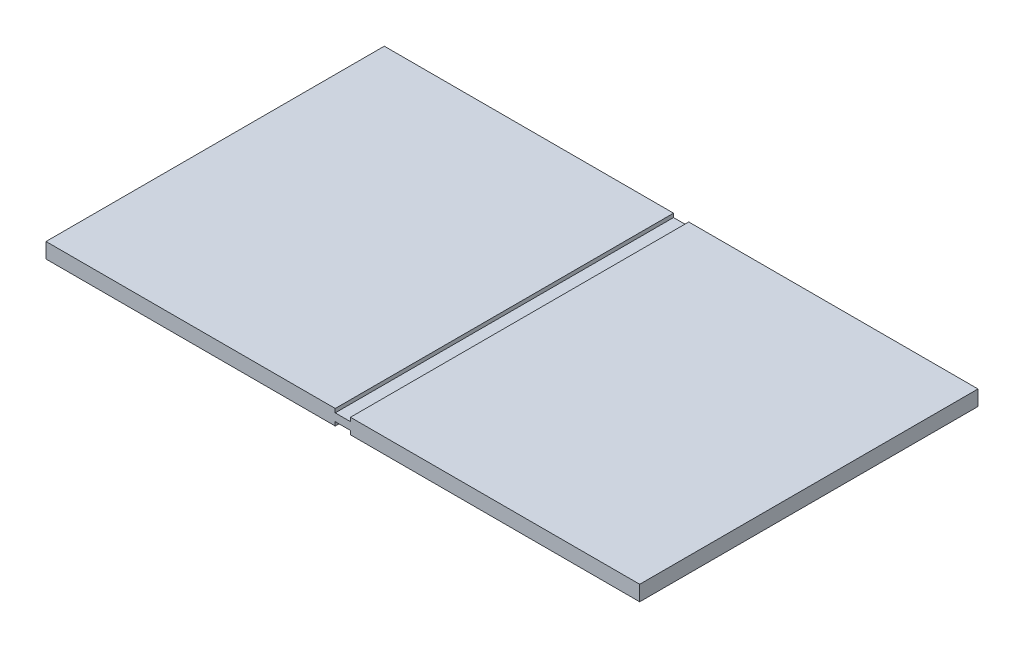
ISO-10303-21;
HEADER;
FILE_DESCRIPTION(('STEP AP214'),'2;1');
FILE_NAME('part.step','',(''),(''),'','','');
FILE_SCHEMA(('AUTOMOTIVE_DESIGN { 1 0 10303 214 1 1 1 1 }'));
ENDSEC;
DATA;
#1=APPLICATION_CONTEXT('core data for automotive mechanical design processes');
#2=APPLICATION_PROTOCOL_DEFINITION('international standard','automotive_design',2000,#1);
#3=PRODUCT_CONTEXT('',#1,'mechanical');
#4=PRODUCT('Part','Part','',(#3));
#5=PRODUCT_RELATED_PRODUCT_CATEGORY('part','',(#4));
#6=PRODUCT_DEFINITION_FORMATION('','',#4);
#7=PRODUCT_DEFINITION_CONTEXT('part definition',#1,'design');
#8=PRODUCT_DEFINITION('design','',#6,#7);
#9=PRODUCT_DEFINITION_SHAPE('','',#8);
#10=(LENGTH_UNIT() NAMED_UNIT(*) SI_UNIT(.MILLI.,.METRE.));
#11=(NAMED_UNIT(*) PLANE_ANGLE_UNIT() SI_UNIT($,.RADIAN.));
#12=(NAMED_UNIT(*) SI_UNIT($,.STERADIAN.) SOLID_ANGLE_UNIT());
#13=UNCERTAINTY_MEASURE_WITH_UNIT(LENGTH_MEASURE(1.E-05),#10,'distance_accuracy_value','');
#14=(GEOMETRIC_REPRESENTATION_CONTEXT(3) GLOBAL_UNCERTAINTY_ASSIGNED_CONTEXT((#13)) GLOBAL_UNIT_ASSIGNED_CONTEXT((#10,
#11,#12)) REPRESENTATION_CONTEXT('',''));
#15=CARTESIAN_POINT('',(0.,0.,0.));
#16=DIRECTION('',(0.,0.,1.));
#17=DIRECTION('',(1.,0.,0.));
#18=AXIS2_PLACEMENT_3D('',#15,#16,#17);
#19=CARTESIAN_POINT('',(0.,0.,0.));
#20=DIRECTION('',(0.,-1.,0.));
#21=DIRECTION('',(0.,0.,-1.));
#22=AXIS2_PLACEMENT_3D('',#19,#20,#21);
#23=PLANE('',#22);
#24=DIRECTION('',(0.,0.,1.));
#25=VECTOR('',#24,1.);
#26=CARTESIAN_POINT('',(9.,0.,-200.));
#27=LINE('',#26,#25);
#28=CARTESIAN_POINT('',(9.,0.,-200.));
#29=VERTEX_POINT('',#28);
#30=CARTESIAN_POINT('',(9.,0.,200.));
#31=VERTEX_POINT('',#30);
#32=EDGE_CURVE('E127',#29,#31,#27,.T.);
#33=ORIENTED_EDGE('',*,*,#32,.F.);
#34=DIRECTION('',(-1.,0.,0.));
#35=VECTOR('',#34,1.);
#36=CARTESIAN_POINT('',(-351.,0.,-200.));
#37=LINE('',#36,#35);
#38=CARTESIAN_POINT('',(351.,0.,-200.));
#39=VERTEX_POINT('',#38);
#40=EDGE_CURVE('E201',#39,#29,#37,.T.);
#41=ORIENTED_EDGE('',*,*,#40,.F.);
#42=DIRECTION('',(0.,0.,-1.));
#43=VECTOR('',#42,1.);
#44=CARTESIAN_POINT('',(351.,0.,200.));
#45=LINE('',#44,#43);
#46=CARTESIAN_POINT('',(351.,0.,200.));
#47=VERTEX_POINT('',#46);
#48=EDGE_CURVE('E176',#47,#39,#45,.T.);
#49=ORIENTED_EDGE('',*,*,#48,.F.);
#50=DIRECTION('',(1.,0.,0.));
#51=VECTOR('',#50,1.);
#52=CARTESIAN_POINT('',(-351.,0.,200.));
#53=LINE('',#52,#51);
#54=EDGE_CURVE('E206',#31,#47,#53,.T.);
#55=ORIENTED_EDGE('',*,*,#54,.F.);
#56=EDGE_LOOP('',(#33,#41,#49,#55));
#57=FACE_BOUND('',#56,.T.);
#58=ADVANCED_FACE('F33',(#57),#23,.T.);
#59=CARTESIAN_POINT('',(0.,18.,0.));
#60=DIRECTION('',(0.,-1.,0.));
#61=DIRECTION('',(0.,0.,-1.));
#62=AXIS2_PLACEMENT_3D('',#59,#60,#61);
#63=PLANE('',#62);
#64=DIRECTION('',(1.,0.,0.));
#65=VECTOR('',#64,1.);
#66=CARTESIAN_POINT('',(-351.,18.,200.));
#67=LINE('',#66,#65);
#68=CARTESIAN_POINT('',(-351.,18.,200.));
#69=VERTEX_POINT('',#68);
#70=CARTESIAN_POINT('',(-9.,18.,200.));
#71=VERTEX_POINT('',#70);
#72=EDGE_CURVE('E194',#69,#71,#67,.T.);
#73=ORIENTED_EDGE('',*,*,#72,.T.);
#74=DIRECTION('',(0.,0.,1.));
#75=VECTOR('',#74,1.);
#76=CARTESIAN_POINT('',(-9.,18.,200.));
#77=LINE('',#76,#75);
#78=CARTESIAN_POINT('',(-9.,18.,-200.));
#79=VERTEX_POINT('',#78);
#80=EDGE_CURVE('E153',#79,#71,#77,.T.);
#81=ORIENTED_EDGE('',*,*,#80,.F.);
#82=DIRECTION('',(-1.,0.,0.));
#83=VECTOR('',#82,1.);
#84=CARTESIAN_POINT('',(-351.,18.,-200.));
#85=LINE('',#84,#83);
#86=CARTESIAN_POINT('',(-351.,18.,-200.));
#87=VERTEX_POINT('',#86);
#88=EDGE_CURVE('E186',#79,#87,#85,.T.);
#89=ORIENTED_EDGE('',*,*,#88,.T.);
#90=DIRECTION('',(0.,0.,1.));
#91=VECTOR('',#90,1.);
#92=CARTESIAN_POINT('',(-351.,18.,200.));
#93=LINE('',#92,#91);
#94=EDGE_CURVE('E191',#87,#69,#93,.T.);
#95=ORIENTED_EDGE('',*,*,#94,.T.);
#96=EDGE_LOOP('',(#73,#81,#89,#95));
#97=FACE_BOUND('',#96,.T.);
#98=ADVANCED_FACE('F229',(#97),#63,.F.);
#99=CARTESIAN_POINT('',(351.,18.,200.));
#100=DIRECTION('',(-1.,0.,0.));
#101=DIRECTION('',(0.,0.,1.));
#102=AXIS2_PLACEMENT_3D('',#99,#100,#101);
#103=PLANE('',#102);
#104=ORIENTED_EDGE('',*,*,#48,.T.);
#105=DIRECTION('',(0.,-1.,0.));
#106=VECTOR('',#105,1.);
#107=CARTESIAN_POINT('',(351.,18.,-200.));
#108=LINE('',#107,#106);
#109=CARTESIAN_POINT('',(351.,18.,-200.));
#110=VERTEX_POINT('',#109);
#111=EDGE_CURVE('E11',#110,#39,#108,.T.);
#112=ORIENTED_EDGE('',*,*,#111,.F.);
#113=DIRECTION('',(0.,0.,-1.));
#114=VECTOR('',#113,1.);
#115=CARTESIAN_POINT('',(351.,18.,200.));
#116=LINE('',#115,#114);
#117=CARTESIAN_POINT('',(351.,18.,200.));
#118=VERTEX_POINT('',#117);
#119=EDGE_CURVE('E183',#118,#110,#116,.T.);
#120=ORIENTED_EDGE('',*,*,#119,.F.);
#121=DIRECTION('',(0.,-1.,0.));
#122=VECTOR('',#121,1.);
#123=CARTESIAN_POINT('',(351.,18.,200.));
#124=LINE('',#123,#122);
#125=EDGE_CURVE('E197',#118,#47,#124,.T.);
#126=ORIENTED_EDGE('',*,*,#125,.T.);
#127=EDGE_LOOP('',(#104,#112,#120,#126));
#128=FACE_BOUND('',#127,.T.);
#129=ADVANCED_FACE('F35',(#128),#103,.F.);
#130=CARTESIAN_POINT('',(-351.,18.,-200.));
#131=DIRECTION('',(0.,0.,1.));
#132=DIRECTION('',(1.,0.,0.));
#133=AXIS2_PLACEMENT_3D('',#130,#131,#132);
#134=PLANE('',#133);
#135=ORIENTED_EDGE('',*,*,#40,.T.);
#136=DIRECTION('',(0.,-1.,0.));
#137=VECTOR('',#136,1.);
#138=CARTESIAN_POINT('',(9.,4.5,-200.));
#139=LINE('',#138,#137);
#140=CARTESIAN_POINT('',(9.,4.5,-200.));
#141=VERTEX_POINT('',#140);
#142=EDGE_CURVE('E151',#141,#29,#139,.T.);
#143=ORIENTED_EDGE('',*,*,#142,.F.);
#144=DIRECTION('',(1.,0.,0.));
#145=VECTOR('',#144,1.);
#146=CARTESIAN_POINT('',(-9.,4.5,-200.));
#147=LINE('',#146,#145);
#148=CARTESIAN_POINT('',(-9.,4.5,-200.));
#149=VERTEX_POINT('',#148);
#150=EDGE_CURVE('E131',#149,#141,#147,.T.);
#151=ORIENTED_EDGE('',*,*,#150,.F.);
#152=DIRECTION('',(0.,-1.,0.));
#153=VECTOR('',#152,1.);
#154=CARTESIAN_POINT('',(-9.,4.5,-200.));
#155=LINE('',#154,#153);
#156=CARTESIAN_POINT('',(-9.,0.,-200.));
#157=VERTEX_POINT('',#156);
#158=EDGE_CURVE('E154',#149,#157,#155,.T.);
#159=ORIENTED_EDGE('',*,*,#158,.T.);
#160=CARTESIAN_POINT('',(-351.,0.,-200.));
#161=VERTEX_POINT('',#160);
#162=EDGE_CURVE('E200',#157,#161,#37,.T.);
#163=ORIENTED_EDGE('',*,*,#162,.T.);
#164=DIRECTION('',(0.,-1.,0.));
#165=VECTOR('',#164,1.);
#166=CARTESIAN_POINT('',(-351.,18.,-200.));
#167=LINE('',#166,#165);
#168=EDGE_CURVE('E41',#87,#161,#167,.T.);
#169=ORIENTED_EDGE('',*,*,#168,.F.);
#170=ORIENTED_EDGE('',*,*,#88,.F.);
#171=DIRECTION('',(0.,1.,0.));
#172=VECTOR('',#171,1.);
#173=CARTESIAN_POINT('',(-9.,13.5,-200.));
#174=LINE('',#173,#172);
#175=CARTESIAN_POINT('',(-9.,13.5,-200.));
#176=VERTEX_POINT('',#175);
#177=EDGE_CURVE('E174',#176,#79,#174,.T.);
#178=ORIENTED_EDGE('',*,*,#177,.F.);
#179=DIRECTION('',(-1.,0.,0.));
#180=VECTOR('',#179,1.);
#181=CARTESIAN_POINT('',(9.,13.5,-200.));
#182=LINE('',#181,#180);
#183=CARTESIAN_POINT('',(9.,13.5,-200.));
#184=VERTEX_POINT('',#183);
#185=EDGE_CURVE('E168',#184,#176,#182,.T.);
#186=ORIENTED_EDGE('',*,*,#185,.F.);
#187=DIRECTION('',(0.,1.,0.));
#188=VECTOR('',#187,1.);
#189=CARTESIAN_POINT('',(9.,13.5,-200.));
#190=LINE('',#189,#188);
#191=CARTESIAN_POINT('',(9.,18.,-200.));
#192=VERTEX_POINT('',#191);
#193=EDGE_CURVE('E177',#184,#192,#190,.T.);
#194=ORIENTED_EDGE('',*,*,#193,.T.);
#195=EDGE_CURVE('E188',#110,#192,#85,.T.);
#196=ORIENTED_EDGE('',*,*,#195,.F.);
#197=ORIENTED_EDGE('',*,*,#111,.T.);
#198=EDGE_LOOP('',(#135,#143,#151,#159,#163,#169,#170,#178,#186,#194,#196,#197));
#199=FACE_BOUND('',#198,.T.);
#200=ADVANCED_FACE('F231',(#199),#134,.F.);
#201=CARTESIAN_POINT('',(-351.,18.,200.));
#202=DIRECTION('',(1.,0.,0.));
#203=DIRECTION('',(0.,0.,-1.));
#204=AXIS2_PLACEMENT_3D('',#201,#202,#203);
#205=PLANE('',#204);
#206=DIRECTION('',(0.,0.,1.));
#207=VECTOR('',#206,1.);
#208=CARTESIAN_POINT('',(-351.,0.,200.));
#209=LINE('',#208,#207);
#210=CARTESIAN_POINT('',(-351.,0.,200.));
#211=VERTEX_POINT('',#210);
#212=EDGE_CURVE('E204',#161,#211,#209,.T.);
#213=ORIENTED_EDGE('',*,*,#212,.T.);
#214=DIRECTION('',(0.,-1.,0.));
#215=VECTOR('',#214,1.);
#216=CARTESIAN_POINT('',(-351.,18.,200.));
#217=LINE('',#216,#215);
#218=EDGE_CURVE('E210',#69,#211,#217,.T.);
#219=ORIENTED_EDGE('',*,*,#218,.F.);
#220=ORIENTED_EDGE('',*,*,#94,.F.);
#221=ORIENTED_EDGE('',*,*,#168,.T.);
#222=EDGE_LOOP('',(#213,#219,#220,#221));
#223=FACE_BOUND('',#222,.T.);
#224=ADVANCED_FACE('F217',(#223),#205,.F.);
#225=CARTESIAN_POINT('',(-351.,18.,200.));
#226=DIRECTION('',(0.,0.,-1.));
#227=DIRECTION('',(-1.,0.,0.));
#228=AXIS2_PLACEMENT_3D('',#225,#226,#227);
#229=PLANE('',#228);
#230=DIRECTION('',(-1.,0.,0.));
#231=VECTOR('',#230,1.);
#232=CARTESIAN_POINT('',(-9.,4.5,200.));
#233=LINE('',#232,#231);
#234=CARTESIAN_POINT('',(9.,4.5,200.));
#235=VERTEX_POINT('',#234);
#236=CARTESIAN_POINT('',(-9.,4.5,200.));
#237=VERTEX_POINT('',#236);
#238=EDGE_CURVE('E137',#235,#237,#233,.T.);
#239=ORIENTED_EDGE('',*,*,#238,.F.);
#240=DIRECTION('',(0.,-1.,0.));
#241=VECTOR('',#240,1.);
#242=CARTESIAN_POINT('',(9.,4.5,200.));
#243=LINE('',#242,#241);
#244=EDGE_CURVE('E121',#235,#31,#243,.T.);
#245=ORIENTED_EDGE('',*,*,#244,.T.);
#246=ORIENTED_EDGE('',*,*,#54,.T.);
#247=ORIENTED_EDGE('',*,*,#125,.F.);
#248=CARTESIAN_POINT('',(9.00000000000001,18.,200.));
#249=VERTEX_POINT('',#248);
#250=EDGE_CURVE('E193',#249,#118,#67,.T.);
#251=ORIENTED_EDGE('',*,*,#250,.F.);
#252=DIRECTION('',(0.,1.,0.));
#253=VECTOR('',#252,1.);
#254=CARTESIAN_POINT('',(9.,13.5,200.));
#255=LINE('',#254,#253);
#256=CARTESIAN_POINT('',(9.,13.5,200.));
#257=VERTEX_POINT('',#256);
#258=EDGE_CURVE('E56',#257,#249,#255,.T.);
#259=ORIENTED_EDGE('',*,*,#258,.F.);
#260=DIRECTION('',(1.,0.,0.));
#261=VECTOR('',#260,1.);
#262=CARTESIAN_POINT('',(9.,13.5,200.));
#263=LINE('',#262,#261);
#264=CARTESIAN_POINT('',(-9.,13.5,200.));
#265=VERTEX_POINT('',#264);
#266=EDGE_CURVE('E161',#265,#257,#263,.T.);
#267=ORIENTED_EDGE('',*,*,#266,.F.);
#268=DIRECTION('',(0.,1.,0.));
#269=VECTOR('',#268,1.);
#270=CARTESIAN_POINT('',(-9.,13.5,200.));
#271=LINE('',#270,#269);
#272=EDGE_CURVE('E171',#265,#71,#271,.T.);
#273=ORIENTED_EDGE('',*,*,#272,.T.);
#274=ORIENTED_EDGE('',*,*,#72,.F.);
#275=ORIENTED_EDGE('',*,*,#218,.T.);
#276=CARTESIAN_POINT('',(-9.00000000000001,0.,200.));
#277=VERTEX_POINT('',#276);
#278=EDGE_CURVE('E187',#211,#277,#53,.T.);
#279=ORIENTED_EDGE('',*,*,#278,.T.);
#280=DIRECTION('',(0.,-1.,0.));
#281=VECTOR('',#280,1.);
#282=CARTESIAN_POINT('',(-9.,4.5,200.));
#283=LINE('',#282,#281);
#284=EDGE_CURVE('E48',#237,#277,#283,.T.);
#285=ORIENTED_EDGE('',*,*,#284,.F.);
#286=EDGE_LOOP('',(#239,#245,#246,#247,#251,#259,#267,#273,#274,#275,#279,#285));
#287=FACE_BOUND('',#286,.T.);
#288=ADVANCED_FACE('F142',(#287),#229,.F.);
#289=ORIENTED_EDGE('',*,*,#195,.T.);
#290=DIRECTION('',(0.,0.,-1.));
#291=VECTOR('',#290,1.);
#292=CARTESIAN_POINT('',(9.,18.,200.));
#293=LINE('',#292,#291);
#294=EDGE_CURVE('E162',#249,#192,#293,.T.);
#295=ORIENTED_EDGE('',*,*,#294,.F.);
#296=ORIENTED_EDGE('',*,*,#250,.T.);
#297=ORIENTED_EDGE('',*,*,#119,.T.);
#298=EDGE_LOOP('',(#289,#295,#296,#297));
#299=FACE_BOUND('',#298,.T.);
#300=ADVANCED_FACE('F239',(#299),#63,.F.);
#301=DIRECTION('',(0.,0.,-1.));
#302=VECTOR('',#301,1.);
#303=CARTESIAN_POINT('',(-9.,0.,-200.));
#304=LINE('',#303,#302);
#305=EDGE_CURVE('E140',#277,#157,#304,.T.);
#306=ORIENTED_EDGE('',*,*,#305,.F.);
#307=ORIENTED_EDGE('',*,*,#278,.F.);
#308=ORIENTED_EDGE('',*,*,#212,.F.);
#309=ORIENTED_EDGE('',*,*,#162,.F.);
#310=EDGE_LOOP('',(#306,#307,#308,#309));
#311=FACE_BOUND('',#310,.T.);
#312=ADVANCED_FACE('F224',(#311),#23,.T.);
#313=CARTESIAN_POINT('',(-9.,13.5,200.));
#314=DIRECTION('',(-1.,0.,0.));
#315=DIRECTION('',(0.,0.,1.));
#316=AXIS2_PLACEMENT_3D('',#313,#314,#315);
#317=PLANE('',#316);
#318=ORIENTED_EDGE('',*,*,#80,.T.);
#319=ORIENTED_EDGE('',*,*,#272,.F.);
#320=DIRECTION('',(0.,0.,1.));
#321=VECTOR('',#320,1.);
#322=CARTESIAN_POINT('',(-9.,13.5,200.));
#323=LINE('',#322,#321);
#324=EDGE_CURVE('E158',#176,#265,#323,.T.);
#325=ORIENTED_EDGE('',*,*,#324,.F.);
#326=ORIENTED_EDGE('',*,*,#177,.T.);
#327=EDGE_LOOP('',(#318,#319,#325,#326));
#328=FACE_BOUND('',#327,.T.);
#329=ADVANCED_FACE('F234',(#328),#317,.F.);
#330=CARTESIAN_POINT('',(9.,13.5,200.));
#331=DIRECTION('',(1.,0.,0.));
#332=DIRECTION('',(0.,0.,-1.));
#333=AXIS2_PLACEMENT_3D('',#330,#331,#332);
#334=PLANE('',#333);
#335=ORIENTED_EDGE('',*,*,#294,.T.);
#336=ORIENTED_EDGE('',*,*,#193,.F.);
#337=DIRECTION('',(0.,0.,-1.));
#338=VECTOR('',#337,1.);
#339=CARTESIAN_POINT('',(9.,13.5,200.));
#340=LINE('',#339,#338);
#341=EDGE_CURVE('E165',#257,#184,#340,.T.);
#342=ORIENTED_EDGE('',*,*,#341,.F.);
#343=ORIENTED_EDGE('',*,*,#258,.T.);
#344=EDGE_LOOP('',(#335,#336,#342,#343));
#345=FACE_BOUND('',#344,.T.);
#346=ADVANCED_FACE('F237',(#345),#334,.F.);
#347=CARTESIAN_POINT('',(0.,13.5,0.));
#348=DIRECTION('',(0.,1.,0.));
#349=DIRECTION('',(0.,0.,1.));
#350=AXIS2_PLACEMENT_3D('',#347,#348,#349);
#351=PLANE('',#350);
#352=ORIENTED_EDGE('',*,*,#324,.T.);
#353=ORIENTED_EDGE('',*,*,#266,.T.);
#354=ORIENTED_EDGE('',*,*,#341,.T.);
#355=ORIENTED_EDGE('',*,*,#185,.T.);
#356=EDGE_LOOP('',(#352,#353,#354,#355));
#357=FACE_BOUND('',#356,.T.);
#358=ADVANCED_FACE('F236',(#357),#351,.T.);
#359=CARTESIAN_POINT('',(9.,4.5,-200.));
#360=DIRECTION('',(1.,0.,0.));
#361=DIRECTION('',(0.,0.,-1.));
#362=AXIS2_PLACEMENT_3D('',#359,#360,#361);
#363=PLANE('',#362);
#364=ORIENTED_EDGE('',*,*,#32,.T.);
#365=ORIENTED_EDGE('',*,*,#244,.F.);
#366=DIRECTION('',(0.,0.,1.));
#367=VECTOR('',#366,1.);
#368=CARTESIAN_POINT('',(9.,4.5,-200.));
#369=LINE('',#368,#367);
#370=EDGE_CURVE('E124',#141,#235,#369,.T.);
#371=ORIENTED_EDGE('',*,*,#370,.F.);
#372=ORIENTED_EDGE('',*,*,#142,.T.);
#373=EDGE_LOOP('',(#364,#365,#371,#372));
#374=FACE_BOUND('',#373,.T.);
#375=ADVANCED_FACE('F123',(#374),#363,.F.);
#376=CARTESIAN_POINT('',(-9.,4.5,-200.));
#377=DIRECTION('',(-1.,0.,0.));
#378=DIRECTION('',(0.,0.,1.));
#379=AXIS2_PLACEMENT_3D('',#376,#377,#378);
#380=PLANE('',#379);
#381=ORIENTED_EDGE('',*,*,#305,.T.);
#382=ORIENTED_EDGE('',*,*,#158,.F.);
#383=DIRECTION('',(0.,0.,-1.));
#384=VECTOR('',#383,1.);
#385=CARTESIAN_POINT('',(-9.,4.5,-200.));
#386=LINE('',#385,#384);
#387=EDGE_CURVE('E144',#237,#149,#386,.T.);
#388=ORIENTED_EDGE('',*,*,#387,.F.);
#389=ORIENTED_EDGE('',*,*,#284,.T.);
#390=EDGE_LOOP('',(#381,#382,#388,#389));
#391=FACE_BOUND('',#390,.T.);
#392=ADVANCED_FACE('F270',(#391),#380,.F.);
#393=CARTESIAN_POINT('',(0.,4.5,0.));
#394=DIRECTION('',(0.,1.,0.));
#395=DIRECTION('',(0.,0.,1.));
#396=AXIS2_PLACEMENT_3D('',#393,#394,#395);
#397=PLANE('',#396);
#398=ORIENTED_EDGE('',*,*,#370,.T.);
#399=ORIENTED_EDGE('',*,*,#238,.T.);
#400=ORIENTED_EDGE('',*,*,#387,.T.);
#401=ORIENTED_EDGE('',*,*,#150,.T.);
#402=EDGE_LOOP('',(#398,#399,#400,#401));
#403=FACE_BOUND('',#402,.T.);
#404=ADVANCED_FACE('F135',(#403),#397,.F.);
#405=CLOSED_SHELL('',(#58,#98,#129,#200,#224,#288,#300,#312,#329,#346,#358,#375,#392,#404));
#406=MANIFOLD_SOLID_BREP('B2',#405);
#407=ADVANCED_BREP_SHAPE_REPRESENTATION('',(#18,#406),#14);
#408=SHAPE_DEFINITION_REPRESENTATION(#9,#407);
ENDSEC;
END-ISO-10303-21;
